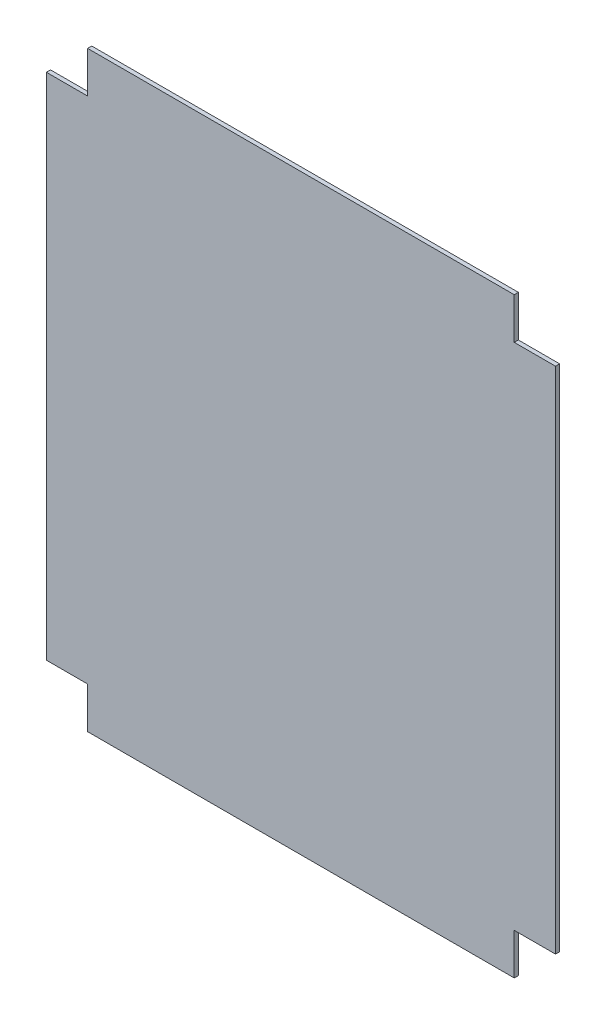
ISO-10303-21;
HEADER;
FILE_DESCRIPTION(('STEP AP214'),'2;1');
FILE_NAME('part.step','',(''),(''),'','','');
FILE_SCHEMA(('AUTOMOTIVE_DESIGN { 1 0 10303 214 1 1 1 1 }'));
ENDSEC;
DATA;
#1=APPLICATION_CONTEXT('core data for automotive mechanical design processes');
#2=APPLICATION_PROTOCOL_DEFINITION('international standard','automotive_design',2000,#1);
#3=PRODUCT_CONTEXT('',#1,'mechanical');
#4=PRODUCT('Part','Part','',(#3));
#5=PRODUCT_RELATED_PRODUCT_CATEGORY('part','',(#4));
#6=PRODUCT_DEFINITION_FORMATION('','',#4);
#7=PRODUCT_DEFINITION_CONTEXT('part definition',#1,'design');
#8=PRODUCT_DEFINITION('design','',#6,#7);
#9=PRODUCT_DEFINITION_SHAPE('','',#8);
#10=(LENGTH_UNIT() NAMED_UNIT(*) SI_UNIT(.MILLI.,.METRE.));
#11=(NAMED_UNIT(*) PLANE_ANGLE_UNIT() SI_UNIT($,.RADIAN.));
#12=(NAMED_UNIT(*) SI_UNIT($,.STERADIAN.) SOLID_ANGLE_UNIT());
#13=UNCERTAINTY_MEASURE_WITH_UNIT(LENGTH_MEASURE(1.E-05),#10,'distance_accuracy_value','');
#14=(GEOMETRIC_REPRESENTATION_CONTEXT(3) GLOBAL_UNCERTAINTY_ASSIGNED_CONTEXT((#13)) GLOBAL_UNIT_ASSIGNED_CONTEXT((#10,
#11,#12)) REPRESENTATION_CONTEXT('',''));
#15=CARTESIAN_POINT('',(0.,0.,0.));
#16=DIRECTION('',(0.,0.,1.));
#17=DIRECTION('',(1.,0.,0.));
#18=AXIS2_PLACEMENT_3D('',#15,#16,#17);
#19=CARTESIAN_POINT('',(-185.,0.,3.));
#20=DIRECTION('',(-1.,0.,0.));
#21=DIRECTION('',(0.,0.,1.));
#22=AXIS2_PLACEMENT_3D('',#19,#20,#21);
#23=PLANE('',#22);
#24=DIRECTION('',(0.,1.,0.));
#25=VECTOR('',#24,1.);
#26=CARTESIAN_POINT('',(-185.,0.,0.));
#27=LINE('',#26,#25);
#28=CARTESIAN_POINT('',(-185.,-185.,0.));
#29=VERTEX_POINT('',#28);
#30=CARTESIAN_POINT('',(-185.,185.,0.));
#31=VERTEX_POINT('',#30);
#32=EDGE_CURVE('E155',#29,#31,#27,.T.);
#33=ORIENTED_EDGE('',*,*,#32,.F.);
#34=DIRECTION('',(0.,0.,-1.));
#35=VECTOR('',#34,1.);
#36=CARTESIAN_POINT('',(-185.,-185.,3.));
#37=LINE('',#36,#35);
#38=CARTESIAN_POINT('',(-185.,-185.,3.));
#39=VERTEX_POINT('',#38);
#40=EDGE_CURVE('E11',#39,#29,#37,.T.);
#41=ORIENTED_EDGE('',*,*,#40,.F.);
#42=DIRECTION('',(0.,1.,0.));
#43=VECTOR('',#42,1.);
#44=CARTESIAN_POINT('',(-185.,0.,3.));
#45=LINE('',#44,#43);
#46=CARTESIAN_POINT('',(-185.,185.,3.));
#47=VERTEX_POINT('',#46);
#48=EDGE_CURVE('E185',#39,#47,#45,.T.);
#49=ORIENTED_EDGE('',*,*,#48,.T.);
#50=DIRECTION('',(0.,0.,-1.));
#51=VECTOR('',#50,1.);
#52=CARTESIAN_POINT('',(-185.,185.,3.));
#53=LINE('',#52,#51);
#54=EDGE_CURVE('E52',#47,#31,#53,.T.);
#55=ORIENTED_EDGE('',*,*,#54,.T.);
#56=EDGE_LOOP('',(#33,#41,#49,#55));
#57=FACE_BOUND('',#56,.T.);
#58=ADVANCED_FACE('F36',(#57),#23,.T.);
#59=CARTESIAN_POINT('',(0.,-185.,3.));
#60=DIRECTION('',(0.,1.,0.));
#61=DIRECTION('',(0.,0.,1.));
#62=AXIS2_PLACEMENT_3D('',#59,#60,#61);
#63=PLANE('',#62);
#64=DIRECTION('',(1.,0.,0.));
#65=VECTOR('',#64,1.);
#66=CARTESIAN_POINT('',(0.,-185.,0.));
#67=LINE('',#66,#65);
#68=CARTESIAN_POINT('',(-155.,-185.,0.));
#69=VERTEX_POINT('',#68);
#70=EDGE_CURVE('E157',#29,#69,#67,.T.);
#71=ORIENTED_EDGE('',*,*,#70,.T.);
#72=DIRECTION('',(0.,0.,-1.));
#73=VECTOR('',#72,1.);
#74=CARTESIAN_POINT('',(-155.,-185.,3.));
#75=LINE('',#74,#73);
#76=CARTESIAN_POINT('',(-155.,-185.,3.));
#77=VERTEX_POINT('',#76);
#78=EDGE_CURVE('E44',#77,#69,#75,.T.);
#79=ORIENTED_EDGE('',*,*,#78,.F.);
#80=DIRECTION('',(1.,0.,0.));
#81=VECTOR('',#80,1.);
#82=CARTESIAN_POINT('',(0.,-185.,3.));
#83=LINE('',#82,#81);
#84=EDGE_CURVE('E363',#39,#77,#83,.T.);
#85=ORIENTED_EDGE('',*,*,#84,.F.);
#86=ORIENTED_EDGE('',*,*,#40,.T.);
#87=EDGE_LOOP('',(#71,#79,#85,#86));
#88=FACE_BOUND('',#87,.T.);
#89=ADVANCED_FACE('F211',(#88),#63,.F.);
#90=CARTESIAN_POINT('',(-155.,1.43403807347416E-13,3.));
#91=DIRECTION('',(-1.,0.,0.));
#92=DIRECTION('',(0.,-1.,0.));
#93=AXIS2_PLACEMENT_3D('',#90,#91,#92);
#94=PLANE('',#93);
#95=DIRECTION('',(0.,1.,0.));
#96=VECTOR('',#95,1.);
#97=CARTESIAN_POINT('',(-155.,1.43403807347416E-13,0.));
#98=LINE('',#97,#96);
#99=CARTESIAN_POINT('',(-155.,-215.,0.));
#100=VERTEX_POINT('',#99);
#101=EDGE_CURVE('E160',#100,#69,#98,.T.);
#102=ORIENTED_EDGE('',*,*,#101,.F.);
#103=DIRECTION('',(0.,0.,-1.));
#104=VECTOR('',#103,1.);
#105=CARTESIAN_POINT('',(-155.,-215.,3.));
#106=LINE('',#105,#104);
#107=CARTESIAN_POINT('',(-155.,-215.,3.));
#108=VERTEX_POINT('',#107);
#109=EDGE_CURVE('E201',#108,#100,#106,.T.);
#110=ORIENTED_EDGE('',*,*,#109,.F.);
#111=DIRECTION('',(0.,1.,0.));
#112=VECTOR('',#111,1.);
#113=CARTESIAN_POINT('',(-155.,1.43403807347416E-13,3.));
#114=LINE('',#113,#112);
#115=EDGE_CURVE('E208',#108,#77,#114,.T.);
#116=ORIENTED_EDGE('',*,*,#115,.T.);
#117=ORIENTED_EDGE('',*,*,#78,.T.);
#118=EDGE_LOOP('',(#102,#110,#116,#117));
#119=FACE_BOUND('',#118,.T.);
#120=ADVANCED_FACE('F206',(#119),#94,.T.);
#121=CARTESIAN_POINT('',(0.,-215.,3.));
#122=DIRECTION('',(0.,1.,0.));
#123=DIRECTION('',(0.,0.,1.));
#124=AXIS2_PLACEMENT_3D('',#121,#122,#123);
#125=PLANE('',#124);
#126=DIRECTION('',(1.,0.,0.));
#127=VECTOR('',#126,1.);
#128=CARTESIAN_POINT('',(0.,-215.,0.));
#129=LINE('',#128,#127);
#130=CARTESIAN_POINT('',(155.,-215.,0.));
#131=VERTEX_POINT('',#130);
#132=EDGE_CURVE('E163',#100,#131,#129,.T.);
#133=ORIENTED_EDGE('',*,*,#132,.T.);
#134=DIRECTION('',(0.,0.,-1.));
#135=VECTOR('',#134,1.);
#136=CARTESIAN_POINT('',(155.,-215.,3.));
#137=LINE('',#136,#135);
#138=CARTESIAN_POINT('',(155.,-215.,3.));
#139=VERTEX_POINT('',#138);
#140=EDGE_CURVE('E198',#139,#131,#137,.T.);
#141=ORIENTED_EDGE('',*,*,#140,.F.);
#142=DIRECTION('',(1.,0.,0.));
#143=VECTOR('',#142,1.);
#144=CARTESIAN_POINT('',(0.,-215.,3.));
#145=LINE('',#144,#143);
#146=EDGE_CURVE('E228',#108,#139,#145,.T.);
#147=ORIENTED_EDGE('',*,*,#146,.F.);
#148=ORIENTED_EDGE('',*,*,#109,.T.);
#149=EDGE_LOOP('',(#133,#141,#147,#148));
#150=FACE_BOUND('',#149,.T.);
#151=ADVANCED_FACE('F218',(#150),#125,.F.);
#152=CARTESIAN_POINT('',(155.,1.43403807347416E-13,3.));
#153=DIRECTION('',(-1.,0.,0.));
#154=DIRECTION('',(0.,-1.,0.));
#155=AXIS2_PLACEMENT_3D('',#152,#153,#154);
#156=PLANE('',#155);
#157=DIRECTION('',(0.,1.,0.));
#158=VECTOR('',#157,1.);
#159=CARTESIAN_POINT('',(155.,1.43403807347416E-13,0.));
#160=LINE('',#159,#158);
#161=CARTESIAN_POINT('',(155.,-185.,0.));
#162=VERTEX_POINT('',#161);
#163=EDGE_CURVE('E165',#131,#162,#160,.T.);
#164=ORIENTED_EDGE('',*,*,#163,.T.);
#165=DIRECTION('',(0.,0.,-1.));
#166=VECTOR('',#165,1.);
#167=CARTESIAN_POINT('',(155.,-185.,3.));
#168=LINE('',#167,#166);
#169=CARTESIAN_POINT('',(155.,-185.,3.));
#170=VERTEX_POINT('',#169);
#171=EDGE_CURVE('E196',#170,#162,#168,.T.);
#172=ORIENTED_EDGE('',*,*,#171,.F.);
#173=DIRECTION('',(0.,1.,0.));
#174=VECTOR('',#173,1.);
#175=CARTESIAN_POINT('',(155.,1.43403807347416E-13,3.));
#176=LINE('',#175,#174);
#177=EDGE_CURVE('E224',#139,#170,#176,.T.);
#178=ORIENTED_EDGE('',*,*,#177,.F.);
#179=ORIENTED_EDGE('',*,*,#140,.T.);
#180=EDGE_LOOP('',(#164,#172,#178,#179));
#181=FACE_BOUND('',#180,.T.);
#182=ADVANCED_FACE('F222',(#181),#156,.F.);
#183=CARTESIAN_POINT('',(0.,-185.,3.));
#184=DIRECTION('',(0.,-1.,0.));
#185=DIRECTION('',(0.,0.,-1.));
#186=AXIS2_PLACEMENT_3D('',#183,#184,#185);
#187=PLANE('',#186);
#188=DIRECTION('',(-1.,0.,0.));
#189=VECTOR('',#188,1.);
#190=CARTESIAN_POINT('',(0.,-185.,0.));
#191=LINE('',#190,#189);
#192=CARTESIAN_POINT('',(185.,-185.,0.));
#193=VERTEX_POINT('',#192);
#194=EDGE_CURVE('E168',#193,#162,#191,.T.);
#195=ORIENTED_EDGE('',*,*,#194,.F.);
#196=DIRECTION('',(0.,0.,-1.));
#197=VECTOR('',#196,1.);
#198=CARTESIAN_POINT('',(185.,-185.,3.));
#199=LINE('',#198,#197);
#200=CARTESIAN_POINT('',(185.,-185.,3.));
#201=VERTEX_POINT('',#200);
#202=EDGE_CURVE('E194',#201,#193,#199,.T.);
#203=ORIENTED_EDGE('',*,*,#202,.F.);
#204=DIRECTION('',(-1.,0.,0.));
#205=VECTOR('',#204,1.);
#206=CARTESIAN_POINT('',(0.,-185.,3.));
#207=LINE('',#206,#205);
#208=EDGE_CURVE('E227',#201,#170,#207,.T.);
#209=ORIENTED_EDGE('',*,*,#208,.T.);
#210=ORIENTED_EDGE('',*,*,#171,.T.);
#211=EDGE_LOOP('',(#195,#203,#209,#210));
#212=FACE_BOUND('',#211,.T.);
#213=ADVANCED_FACE('F268',(#212),#187,.T.);
#214=CARTESIAN_POINT('',(185.,0.,3.));
#215=DIRECTION('',(-1.,0.,0.));
#216=DIRECTION('',(0.,0.,1.));
#217=AXIS2_PLACEMENT_3D('',#214,#215,#216);
#218=PLANE('',#217);
#219=DIRECTION('',(0.,1.,0.));
#220=VECTOR('',#219,1.);
#221=CARTESIAN_POINT('',(185.,0.,0.));
#222=LINE('',#221,#220);
#223=CARTESIAN_POINT('',(185.,185.,0.));
#224=VERTEX_POINT('',#223);
#225=EDGE_CURVE('E171',#193,#224,#222,.T.);
#226=ORIENTED_EDGE('',*,*,#225,.T.);
#227=DIRECTION('',(0.,0.,-1.));
#228=VECTOR('',#227,1.);
#229=CARTESIAN_POINT('',(185.,185.,3.));
#230=LINE('',#229,#228);
#231=CARTESIAN_POINT('',(185.,185.,3.));
#232=VERTEX_POINT('',#231);
#233=EDGE_CURVE('E191',#232,#224,#230,.T.);
#234=ORIENTED_EDGE('',*,*,#233,.F.);
#235=DIRECTION('',(0.,1.,0.));
#236=VECTOR('',#235,1.);
#237=CARTESIAN_POINT('',(185.,0.,3.));
#238=LINE('',#237,#236);
#239=EDGE_CURVE('E230',#201,#232,#238,.T.);
#240=ORIENTED_EDGE('',*,*,#239,.F.);
#241=ORIENTED_EDGE('',*,*,#202,.T.);
#242=EDGE_LOOP('',(#226,#234,#240,#241));
#243=FACE_BOUND('',#242,.T.);
#244=ADVANCED_FACE('F271',(#243),#218,.F.);
#245=CARTESIAN_POINT('',(0.,185.,3.));
#246=DIRECTION('',(0.,-1.,0.));
#247=DIRECTION('',(0.,0.,-1.));
#248=AXIS2_PLACEMENT_3D('',#245,#246,#247);
#249=PLANE('',#248);
#250=DIRECTION('',(-1.,0.,0.));
#251=VECTOR('',#250,1.);
#252=CARTESIAN_POINT('',(0.,185.,0.));
#253=LINE('',#252,#251);
#254=CARTESIAN_POINT('',(155.,185.,0.));
#255=VERTEX_POINT('',#254);
#256=EDGE_CURVE('E173',#224,#255,#253,.T.);
#257=ORIENTED_EDGE('',*,*,#256,.T.);
#258=DIRECTION('',(0.,0.,-1.));
#259=VECTOR('',#258,1.);
#260=CARTESIAN_POINT('',(155.,185.,3.));
#261=LINE('',#260,#259);
#262=CARTESIAN_POINT('',(155.,185.,3.));
#263=VERTEX_POINT('',#262);
#264=EDGE_CURVE('E189',#263,#255,#261,.T.);
#265=ORIENTED_EDGE('',*,*,#264,.F.);
#266=DIRECTION('',(-1.,0.,0.));
#267=VECTOR('',#266,1.);
#268=CARTESIAN_POINT('',(0.,185.,3.));
#269=LINE('',#268,#267);
#270=EDGE_CURVE('E150',#232,#263,#269,.T.);
#271=ORIENTED_EDGE('',*,*,#270,.F.);
#272=ORIENTED_EDGE('',*,*,#233,.T.);
#273=EDGE_LOOP('',(#257,#265,#271,#272));
#274=FACE_BOUND('',#273,.T.);
#275=ADVANCED_FACE('F240',(#274),#249,.F.);
#276=CARTESIAN_POINT('',(155.,-1.43403807347416E-13,3.));
#277=DIRECTION('',(1.,0.,0.));
#278=DIRECTION('',(0.,1.,0.));
#279=AXIS2_PLACEMENT_3D('',#276,#277,#278);
#280=PLANE('',#279);
#281=DIRECTION('',(0.,-1.,0.));
#282=VECTOR('',#281,1.);
#283=CARTESIAN_POINT('',(155.,-1.43403807347416E-13,0.));
#284=LINE('',#283,#282);
#285=CARTESIAN_POINT('',(155.,215.,0.));
#286=VERTEX_POINT('',#285);
#287=EDGE_CURVE('E176',#286,#255,#284,.T.);
#288=ORIENTED_EDGE('',*,*,#287,.F.);
#289=DIRECTION('',(0.,0.,-1.));
#290=VECTOR('',#289,1.);
#291=CARTESIAN_POINT('',(155.,215.,3.));
#292=LINE('',#291,#290);
#293=CARTESIAN_POINT('',(155.,215.,3.));
#294=VERTEX_POINT('',#293);
#295=EDGE_CURVE('E136',#294,#286,#292,.T.);
#296=ORIENTED_EDGE('',*,*,#295,.F.);
#297=DIRECTION('',(0.,-1.,0.));
#298=VECTOR('',#297,1.);
#299=CARTESIAN_POINT('',(155.,-1.43403807347416E-13,3.));
#300=LINE('',#299,#298);
#301=EDGE_CURVE('E148',#294,#263,#300,.T.);
#302=ORIENTED_EDGE('',*,*,#301,.T.);
#303=ORIENTED_EDGE('',*,*,#264,.T.);
#304=EDGE_LOOP('',(#288,#296,#302,#303));
#305=FACE_BOUND('',#304,.T.);
#306=ADVANCED_FACE('F244',(#305),#280,.T.);
#307=CARTESIAN_POINT('',(0.,215.,3.));
#308=DIRECTION('',(0.,1.,0.));
#309=DIRECTION('',(0.,0.,1.));
#310=AXIS2_PLACEMENT_3D('',#307,#308,#309);
#311=PLANE('',#310);
#312=DIRECTION('',(1.,0.,0.));
#313=VECTOR('',#312,1.);
#314=CARTESIAN_POINT('',(0.,215.,0.));
#315=LINE('',#314,#313);
#316=CARTESIAN_POINT('',(-155.,215.,0.));
#317=VERTEX_POINT('',#316);
#318=EDGE_CURVE('E133',#317,#286,#315,.T.);
#319=ORIENTED_EDGE('',*,*,#318,.F.);
#320=DIRECTION('',(0.,0.,-1.));
#321=VECTOR('',#320,1.);
#322=CARTESIAN_POINT('',(-155.,215.,3.));
#323=LINE('',#322,#321);
#324=CARTESIAN_POINT('',(-155.,215.,3.));
#325=VERTEX_POINT('',#324);
#326=EDGE_CURVE('E127',#325,#317,#323,.T.);
#327=ORIENTED_EDGE('',*,*,#326,.F.);
#328=DIRECTION('',(1.,0.,0.));
#329=VECTOR('',#328,1.);
#330=CARTESIAN_POINT('',(0.,215.,3.));
#331=LINE('',#330,#329);
#332=EDGE_CURVE('E131',#325,#294,#331,.T.);
#333=ORIENTED_EDGE('',*,*,#332,.T.);
#334=ORIENTED_EDGE('',*,*,#295,.T.);
#335=EDGE_LOOP('',(#319,#327,#333,#334));
#336=FACE_BOUND('',#335,.T.);
#337=ADVANCED_FACE('F129',(#336),#311,.T.);
#338=CARTESIAN_POINT('',(-155.,-1.43403807347416E-13,3.));
#339=DIRECTION('',(1.,0.,0.));
#340=DIRECTION('',(0.,1.,0.));
#341=AXIS2_PLACEMENT_3D('',#338,#339,#340);
#342=PLANE('',#341);
#343=DIRECTION('',(0.,-1.,0.));
#344=VECTOR('',#343,1.);
#345=CARTESIAN_POINT('',(-155.,-1.43403807347416E-13,0.));
#346=LINE('',#345,#344);
#347=CARTESIAN_POINT('',(-155.,185.,0.));
#348=VERTEX_POINT('',#347);
#349=EDGE_CURVE('E180',#317,#348,#346,.T.);
#350=ORIENTED_EDGE('',*,*,#349,.T.);
#351=DIRECTION('',(0.,0.,-1.));
#352=VECTOR('',#351,1.);
#353=CARTESIAN_POINT('',(-155.,185.,3.));
#354=LINE('',#353,#352);
#355=CARTESIAN_POINT('',(-155.,185.,3.));
#356=VERTEX_POINT('',#355);
#357=EDGE_CURVE('E90',#356,#348,#354,.T.);
#358=ORIENTED_EDGE('',*,*,#357,.F.);
#359=DIRECTION('',(0.,-1.,0.));
#360=VECTOR('',#359,1.);
#361=CARTESIAN_POINT('',(-155.,-1.43403807347416E-13,3.));
#362=LINE('',#361,#360);
#363=EDGE_CURVE('E138',#325,#356,#362,.T.);
#364=ORIENTED_EDGE('',*,*,#363,.F.);
#365=ORIENTED_EDGE('',*,*,#326,.T.);
#366=EDGE_LOOP('',(#350,#358,#364,#365));
#367=FACE_BOUND('',#366,.T.);
#368=ADVANCED_FACE('F139',(#367),#342,.F.);
#369=CARTESIAN_POINT('',(0.,185.,3.));
#370=DIRECTION('',(0.,1.,0.));
#371=DIRECTION('',(0.,0.,1.));
#372=AXIS2_PLACEMENT_3D('',#369,#370,#371);
#373=PLANE('',#372);
#374=DIRECTION('',(1.,0.,0.));
#375=VECTOR('',#374,1.);
#376=CARTESIAN_POINT('',(0.,185.,0.));
#377=LINE('',#376,#375);
#378=EDGE_CURVE('E182',#31,#348,#377,.T.);
#379=ORIENTED_EDGE('',*,*,#378,.F.);
#380=ORIENTED_EDGE('',*,*,#54,.F.);
#381=DIRECTION('',(1.,0.,0.));
#382=VECTOR('',#381,1.);
#383=CARTESIAN_POINT('',(0.,185.,3.));
#384=LINE('',#383,#382);
#385=EDGE_CURVE('E142',#47,#356,#384,.T.);
#386=ORIENTED_EDGE('',*,*,#385,.T.);
#387=ORIENTED_EDGE('',*,*,#357,.T.);
#388=EDGE_LOOP('',(#379,#380,#386,#387));
#389=FACE_BOUND('',#388,.T.);
#390=ADVANCED_FACE('F245',(#389),#373,.T.);
#391=CARTESIAN_POINT('',(0.,0.,3.));
#392=DIRECTION('',(0.,0.,1.));
#393=DIRECTION('',(1.,0.,0.));
#394=AXIS2_PLACEMENT_3D('',#391,#392,#393);
#395=PLANE('',#394);
#396=ORIENTED_EDGE('',*,*,#48,.F.);
#397=ORIENTED_EDGE('',*,*,#84,.T.);
#398=ORIENTED_EDGE('',*,*,#115,.F.);
#399=ORIENTED_EDGE('',*,*,#146,.T.);
#400=ORIENTED_EDGE('',*,*,#177,.T.);
#401=ORIENTED_EDGE('',*,*,#208,.F.);
#402=ORIENTED_EDGE('',*,*,#239,.T.);
#403=ORIENTED_EDGE('',*,*,#270,.T.);
#404=ORIENTED_EDGE('',*,*,#301,.F.);
#405=ORIENTED_EDGE('',*,*,#332,.F.);
#406=ORIENTED_EDGE('',*,*,#363,.T.);
#407=ORIENTED_EDGE('',*,*,#385,.F.);
#408=EDGE_LOOP('',(#396,#397,#398,#399,#400,#401,#402,#403,#404,#405,#406,#407));
#409=FACE_BOUND('',#408,.T.);
#410=ADVANCED_FACE('F146',(#409),#395,.T.);
#411=CARTESIAN_POINT('',(0.,0.,0.));
#412=DIRECTION('',(0.,0.,1.));
#413=DIRECTION('',(1.,0.,0.));
#414=AXIS2_PLACEMENT_3D('',#411,#412,#413);
#415=PLANE('',#414);
#416=ORIENTED_EDGE('',*,*,#32,.T.);
#417=ORIENTED_EDGE('',*,*,#378,.T.);
#418=ORIENTED_EDGE('',*,*,#349,.F.);
#419=ORIENTED_EDGE('',*,*,#318,.T.);
#420=ORIENTED_EDGE('',*,*,#287,.T.);
#421=ORIENTED_EDGE('',*,*,#256,.F.);
#422=ORIENTED_EDGE('',*,*,#225,.F.);
#423=ORIENTED_EDGE('',*,*,#194,.T.);
#424=ORIENTED_EDGE('',*,*,#163,.F.);
#425=ORIENTED_EDGE('',*,*,#132,.F.);
#426=ORIENTED_EDGE('',*,*,#101,.T.);
#427=ORIENTED_EDGE('',*,*,#70,.F.);
#428=EDGE_LOOP('',(#416,#417,#418,#419,#420,#421,#422,#423,#424,#425,#426,#427));
#429=FACE_BOUND('',#428,.T.);
#430=ADVANCED_FACE('F214',(#429),#415,.F.);
#431=CLOSED_SHELL('',(#58,#89,#120,#151,#182,#213,#244,#275,#306,#337,#368,#390,#410,#430));
#432=MANIFOLD_SOLID_BREP('B2',#431);
#433=ADVANCED_BREP_SHAPE_REPRESENTATION('',(#18,#432),#14);
#434=SHAPE_DEFINITION_REPRESENTATION(#9,#433);
ENDSEC;
END-ISO-10303-21;
